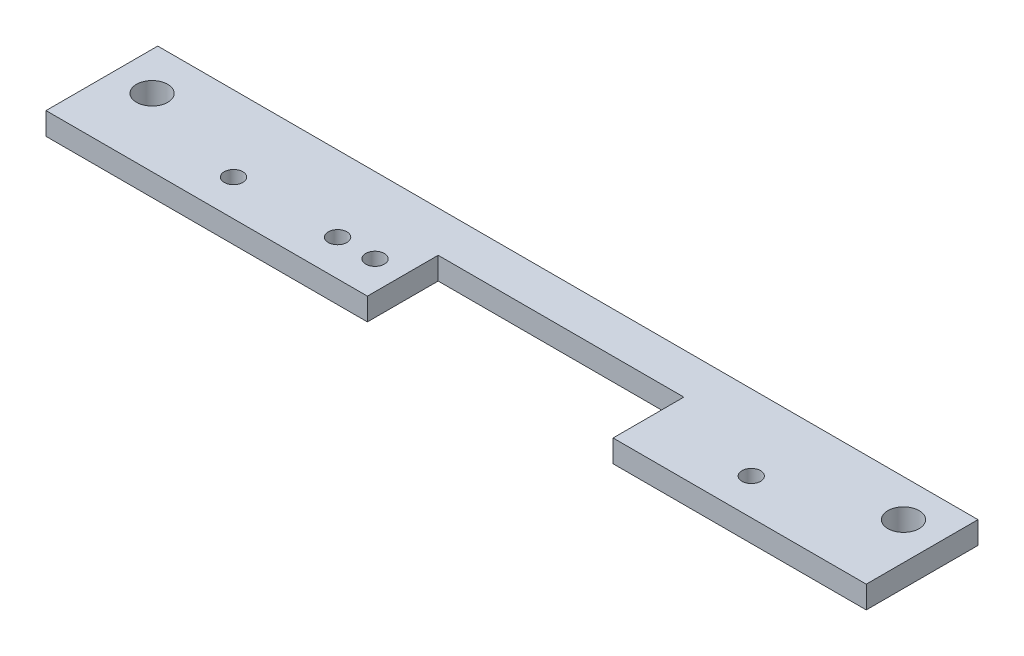
ISO-10303-21;
HEADER;
FILE_DESCRIPTION(('STEP AP214'),'2;1');
FILE_NAME('part.step','',(''),(''),'','','');
FILE_SCHEMA(('AUTOMOTIVE_DESIGN { 1 0 10303 214 1 1 1 1 }'));
ENDSEC;
DATA;
#1=APPLICATION_CONTEXT('core data for automotive mechanical design processes');
#2=APPLICATION_PROTOCOL_DEFINITION('international standard','automotive_design',2000,#1);
#3=PRODUCT_CONTEXT('',#1,'mechanical');
#4=PRODUCT('Part','Part','',(#3));
#5=PRODUCT_RELATED_PRODUCT_CATEGORY('part','',(#4));
#6=PRODUCT_DEFINITION_FORMATION('','',#4);
#7=PRODUCT_DEFINITION_CONTEXT('part definition',#1,'design');
#8=PRODUCT_DEFINITION('design','',#6,#7);
#9=PRODUCT_DEFINITION_SHAPE('','',#8);
#10=(LENGTH_UNIT() NAMED_UNIT(*) SI_UNIT(.MILLI.,.METRE.));
#11=(NAMED_UNIT(*) PLANE_ANGLE_UNIT() SI_UNIT($,.RADIAN.));
#12=(NAMED_UNIT(*) SI_UNIT($,.STERADIAN.) SOLID_ANGLE_UNIT());
#13=UNCERTAINTY_MEASURE_WITH_UNIT(LENGTH_MEASURE(1.E-05),#10,'distance_accuracy_value','');
#14=(GEOMETRIC_REPRESENTATION_CONTEXT(3) GLOBAL_UNCERTAINTY_ASSIGNED_CONTEXT((#13)) GLOBAL_UNIT_ASSIGNED_CONTEXT((#10,
#11,#12)) REPRESENTATION_CONTEXT('',''));
#15=CARTESIAN_POINT('',(0.,0.,0.));
#16=DIRECTION('',(0.,0.,1.));
#17=DIRECTION('',(1.,0.,0.));
#18=AXIS2_PLACEMENT_3D('',#15,#16,#17);
#19=CARTESIAN_POINT('',(-55.055,3.,7.5));
#20=DIRECTION('',(0.,0.,-1.));
#21=DIRECTION('',(-1.,0.,0.));
#22=AXIS2_PLACEMENT_3D('',#19,#20,#21);
#23=PLANE('',#22);
#24=DIRECTION('',(1.,0.,0.));
#25=VECTOR('',#24,1.);
#26=CARTESIAN_POINT('',(-55.055,0.,7.5));
#27=LINE('',#26,#25);
#28=CARTESIAN_POINT('',(-55.055,0.,7.5));
#29=VERTEX_POINT('',#28);
#30=CARTESIAN_POINT('',(-11.911431368498,0.,7.5));
#31=VERTEX_POINT('',#30);
#32=EDGE_CURVE('E137',#29,#31,#27,.T.);
#33=ORIENTED_EDGE('',*,*,#32,.T.);
#34=DIRECTION('',(0.,1.,0.));
#35=VECTOR('',#34,1.);
#36=CARTESIAN_POINT('',(-11.911431368498,0.,7.5));
#37=LINE('',#36,#35);
#38=CARTESIAN_POINT('',(-11.911431368498,3.,7.5));
#39=VERTEX_POINT('',#38);
#40=EDGE_CURVE('E164',#31,#39,#37,.T.);
#41=ORIENTED_EDGE('',*,*,#40,.T.);
#42=DIRECTION('',(1.,0.,0.));
#43=VECTOR('',#42,1.);
#44=CARTESIAN_POINT('',(-55.055,3.,7.5));
#45=LINE('',#44,#43);
#46=CARTESIAN_POINT('',(-55.055,3.,7.5));
#47=VERTEX_POINT('',#46);
#48=EDGE_CURVE('E151',#47,#39,#45,.T.);
#49=ORIENTED_EDGE('',*,*,#48,.F.);
#50=DIRECTION('',(0.,-1.,0.));
#51=VECTOR('',#50,1.);
#52=CARTESIAN_POINT('',(-55.055,3.,7.5));
#53=LINE('',#52,#51);
#54=EDGE_CURVE('E150',#47,#29,#53,.T.);
#55=ORIENTED_EDGE('',*,*,#54,.T.);
#56=EDGE_LOOP('',(#33,#41,#49,#55));
#57=FACE_BOUND('',#56,.T.);
#58=ADVANCED_FACE('F39',(#57),#23,.F.);
#59=CARTESIAN_POINT('',(0.,3.,0.));
#60=DIRECTION('',(0.,-1.,0.));
#61=DIRECTION('',(0.,0.,-1.));
#62=AXIS2_PLACEMENT_3D('',#59,#60,#61);
#63=PLANE('',#62);
#64=DIRECTION('',(-1.,0.,0.));
#65=VECTOR('',#64,1.);
#66=CARTESIAN_POINT('',(-11.911431368498,3.,-1.99955122375872));
#67=LINE('',#66,#65);
#68=CARTESIAN_POINT('',(21.0683567200993,3.,-1.99955122375872));
#69=VERTEX_POINT('',#68);
#70=CARTESIAN_POINT('',(-11.911431368498,3.,-1.99955122375872));
#71=VERTEX_POINT('',#70);
#72=EDGE_CURVE('E237',#69,#71,#67,.T.);
#73=ORIENTED_EDGE('',*,*,#72,.F.);
#74=DIRECTION('',(0.,0.,-1.));
#75=VECTOR('',#74,1.);
#76=CARTESIAN_POINT('',(21.0683567200993,3.,-1.99955122375872));
#77=LINE('',#76,#75);
#78=CARTESIAN_POINT('',(21.0683567200993,3.,7.5));
#79=VERTEX_POINT('',#78);
#80=EDGE_CURVE('E126',#79,#69,#77,.T.);
#81=ORIENTED_EDGE('',*,*,#80,.F.);
#82=CARTESIAN_POINT('',(55.055,3.,7.5));
#83=VERTEX_POINT('',#82);
#84=EDGE_CURVE('E57',#79,#83,#45,.T.);
#85=ORIENTED_EDGE('',*,*,#84,.T.);
#86=DIRECTION('',(0.,0.,-1.));
#87=VECTOR('',#86,1.);
#88=CARTESIAN_POINT('',(55.055,3.,7.5));
#89=LINE('',#88,#87);
#90=CARTESIAN_POINT('',(55.055,3.,-7.5));
#91=VERTEX_POINT('',#90);
#92=EDGE_CURVE('E142',#83,#91,#89,.T.);
#93=ORIENTED_EDGE('',*,*,#92,.T.);
#94=DIRECTION('',(-1.,0.,0.));
#95=VECTOR('',#94,1.);
#96=CARTESIAN_POINT('',(-55.055,3.,-7.5));
#97=LINE('',#96,#95);
#98=CARTESIAN_POINT('',(-55.055,3.,-7.5));
#99=VERTEX_POINT('',#98);
#100=EDGE_CURVE('E90',#91,#99,#97,.T.);
#101=ORIENTED_EDGE('',*,*,#100,.T.);
#102=DIRECTION('',(0.,0.,1.));
#103=VECTOR('',#102,1.);
#104=CARTESIAN_POINT('',(-55.055,3.,7.5));
#105=LINE('',#104,#103);
#106=EDGE_CURVE('E156',#99,#47,#105,.T.);
#107=ORIENTED_EDGE('',*,*,#106,.T.);
#108=ORIENTED_EDGE('',*,*,#48,.T.);
#109=DIRECTION('',(0.,0.,1.));
#110=VECTOR('',#109,1.);
#111=CARTESIAN_POINT('',(-11.911431368498,3.,7.5));
#112=LINE('',#111,#110);
#113=EDGE_CURVE('E241',#71,#39,#112,.T.);
#114=ORIENTED_EDGE('',*,*,#113,.F.);
#115=EDGE_LOOP('',(#73,#81,#85,#93,#101,#107,#108,#114));
#116=FACE_BOUND('',#115,.T.);
#117=CARTESIAN_POINT('',(50.055,3.,-2.50000000000002));
#118=DIRECTION('',(0.,1.,0.));
#119=DIRECTION('',(0.,0.,1.));
#120=AXIS2_PLACEMENT_3D('',#117,#118,#119);
#121=CIRCLE('',#120,2.1);
#122=CARTESIAN_POINT('',(50.055,3.,-0.400000000000026));
#123=VERTEX_POINT('',#122);
#124=EDGE_CURVE('E174',#123,#123,#121,.T.);
#125=ORIENTED_EDGE('',*,*,#124,.F.);
#126=EDGE_LOOP('',(#125));
#127=FACE_BOUND('',#126,.T.);
#128=CARTESIAN_POINT('',(-49.9411923064171,3.,-1.62734645016294));
#129=DIRECTION('',(0.,1.,0.));
#130=DIRECTION('',(0.,0.,1.));
#131=AXIS2_PLACEMENT_3D('',#128,#129,#130);
#132=CIRCLE('',#131,2.1);
#133=CARTESIAN_POINT('',(-49.9411923064171,3.,0.472653549837054));
#134=VERTEX_POINT('',#133);
#135=EDGE_CURVE('E188',#134,#134,#132,.T.);
#136=ORIENTED_EDGE('',*,*,#135,.F.);
#137=EDGE_LOOP('',(#136));
#138=FACE_BOUND('',#137,.T.);
#139=CARTESIAN_POINT('',(-20.7659046089109,3.,2.64603221322138));
#140=DIRECTION('',(0.,1.,0.));
#141=DIRECTION('',(0.,0.,1.));
#142=AXIS2_PLACEMENT_3D('',#139,#140,#141);
#143=CIRCLE('',#142,1.25);
#144=CARTESIAN_POINT('',(-20.7659046089109,3.,3.89603221322138));
#145=VERTEX_POINT('',#144);
#146=EDGE_CURVE('E196',#145,#145,#143,.T.);
#147=ORIENTED_EDGE('',*,*,#146,.F.);
#148=EDGE_LOOP('',(#147));
#149=FACE_BOUND('',#148,.T.);
#150=CARTESIAN_POINT('',(-34.7359046089109,3.,2.64603221322138));
#151=DIRECTION('',(0.,1.,0.));
#152=DIRECTION('',(0.,0.,1.));
#153=AXIS2_PLACEMENT_3D('',#150,#151,#152);
#154=CIRCLE('',#153,1.25);
#155=CARTESIAN_POINT('',(-34.7359046089109,3.,3.89603221322138));
#156=VERTEX_POINT('',#155);
#157=EDGE_CURVE('E204',#156,#156,#154,.T.);
#158=ORIENTED_EDGE('',*,*,#157,.F.);
#159=EDGE_LOOP('',(#158));
#160=FACE_BOUND('',#159,.T.);
#161=CARTESIAN_POINT('',(-15.7359046089109,3.,2.64603221322138));
#162=DIRECTION('',(0.,1.,0.));
#163=DIRECTION('',(0.,0.,1.));
#164=AXIS2_PLACEMENT_3D('',#161,#162,#163);
#165=CIRCLE('',#164,1.25);
#166=CARTESIAN_POINT('',(-15.7359046089109,3.,3.89603221322138));
#167=VERTEX_POINT('',#166);
#168=EDGE_CURVE('E212',#167,#167,#165,.T.);
#169=ORIENTED_EDGE('',*,*,#168,.F.);
#170=EDGE_LOOP('',(#169));
#171=FACE_BOUND('',#170,.T.);
#172=CARTESIAN_POINT('',(34.7640953910891,3.,2.64603221322138));
#173=DIRECTION('',(0.,1.,0.));
#174=DIRECTION('',(0.,0.,1.));
#175=AXIS2_PLACEMENT_3D('',#172,#173,#174);
#176=CIRCLE('',#175,1.25);
#177=CARTESIAN_POINT('',(34.7640953910891,3.,3.89603221322138));
#178=VERTEX_POINT('',#177);
#179=EDGE_CURVE('E220',#178,#178,#176,.T.);
#180=ORIENTED_EDGE('',*,*,#179,.F.);
#181=EDGE_LOOP('',(#180));
#182=FACE_BOUND('',#181,.T.);
#183=ADVANCED_FACE('F251',(#116,#127,#138,#149,#160,#171,#182),#63,.F.);
#184=CARTESIAN_POINT('',(0.,0.,0.));
#185=DIRECTION('',(0.,-1.,0.));
#186=DIRECTION('',(0.,0.,-1.));
#187=AXIS2_PLACEMENT_3D('',#184,#185,#186);
#188=PLANE('',#187);
#189=DIRECTION('',(0.,0.,-1.));
#190=VECTOR('',#189,1.);
#191=CARTESIAN_POINT('',(21.0683567200993,0.,-1.99955122375872));
#192=LINE('',#191,#190);
#193=CARTESIAN_POINT('',(21.0683567200993,0.,7.5));
#194=VERTEX_POINT('',#193);
#195=CARTESIAN_POINT('',(21.0683567200993,0.,-1.99955122375872));
#196=VERTEX_POINT('',#195);
#197=EDGE_CURVE('E117',#194,#196,#192,.T.);
#198=ORIENTED_EDGE('',*,*,#197,.T.);
#199=DIRECTION('',(-1.,0.,0.));
#200=VECTOR('',#199,1.);
#201=CARTESIAN_POINT('',(-11.911431368498,0.,-1.99955122375872));
#202=LINE('',#201,#200);
#203=CARTESIAN_POINT('',(-11.911431368498,0.,-1.99955122375872));
#204=VERTEX_POINT('',#203);
#205=EDGE_CURVE('E234',#196,#204,#202,.T.);
#206=ORIENTED_EDGE('',*,*,#205,.T.);
#207=DIRECTION('',(0.,0.,1.));
#208=VECTOR('',#207,1.);
#209=CARTESIAN_POINT('',(-11.911431368498,0.,7.5));
#210=LINE('',#209,#208);
#211=EDGE_CURVE('E160',#204,#31,#210,.T.);
#212=ORIENTED_EDGE('',*,*,#211,.T.);
#213=ORIENTED_EDGE('',*,*,#32,.F.);
#214=DIRECTION('',(0.,0.,1.));
#215=VECTOR('',#214,1.);
#216=CARTESIAN_POINT('',(-55.055,0.,7.5));
#217=LINE('',#216,#215);
#218=CARTESIAN_POINT('',(-55.055,0.,-7.5));
#219=VERTEX_POINT('',#218);
#220=EDGE_CURVE('E76',#219,#29,#217,.T.);
#221=ORIENTED_EDGE('',*,*,#220,.F.);
#222=DIRECTION('',(-1.,0.,0.));
#223=VECTOR('',#222,1.);
#224=CARTESIAN_POINT('',(-55.055,0.,-7.5));
#225=LINE('',#224,#223);
#226=CARTESIAN_POINT('',(55.055,0.,-7.5));
#227=VERTEX_POINT('',#226);
#228=EDGE_CURVE('E143',#227,#219,#225,.T.);
#229=ORIENTED_EDGE('',*,*,#228,.F.);
#230=DIRECTION('',(0.,0.,-1.));
#231=VECTOR('',#230,1.);
#232=CARTESIAN_POINT('',(55.055,0.,7.5));
#233=LINE('',#232,#231);
#234=CARTESIAN_POINT('',(55.055,0.,7.5));
#235=VERTEX_POINT('',#234);
#236=EDGE_CURVE('E135',#235,#227,#233,.T.);
#237=ORIENTED_EDGE('',*,*,#236,.F.);
#238=EDGE_CURVE('E83',#194,#235,#27,.T.);
#239=ORIENTED_EDGE('',*,*,#238,.F.);
#240=EDGE_LOOP('',(#198,#206,#212,#213,#221,#229,#237,#239));
#241=FACE_BOUND('',#240,.T.);
#242=CARTESIAN_POINT('',(-15.7359046089109,0.,2.64603221322138));
#243=DIRECTION('',(0.,1.,0.));
#244=DIRECTION('',(0.,0.,1.));
#245=AXIS2_PLACEMENT_3D('',#242,#243,#244);
#246=CIRCLE('',#245,1.25);
#247=CARTESIAN_POINT('',(-15.7359046089109,0.,3.89603221322138));
#248=VERTEX_POINT('',#247);
#249=EDGE_CURVE('E216',#248,#248,#246,.T.);
#250=ORIENTED_EDGE('',*,*,#249,.T.);
#251=EDGE_LOOP('',(#250));
#252=FACE_BOUND('',#251,.T.);
#253=CARTESIAN_POINT('',(-20.7659046089109,0.,2.64603221322138));
#254=DIRECTION('',(0.,1.,0.));
#255=DIRECTION('',(0.,0.,1.));
#256=AXIS2_PLACEMENT_3D('',#253,#254,#255);
#257=CIRCLE('',#256,1.25);
#258=CARTESIAN_POINT('',(-20.7659046089109,0.,3.89603221322138));
#259=VERTEX_POINT('',#258);
#260=EDGE_CURVE('E200',#259,#259,#257,.T.);
#261=ORIENTED_EDGE('',*,*,#260,.T.);
#262=EDGE_LOOP('',(#261));
#263=FACE_BOUND('',#262,.T.);
#264=CARTESIAN_POINT('',(50.055,0.,-2.50000000000002));
#265=DIRECTION('',(0.,1.,0.));
#266=DIRECTION('',(0.,0.,1.));
#267=AXIS2_PLACEMENT_3D('',#264,#265,#266);
#268=CIRCLE('',#267,2.1);
#269=CARTESIAN_POINT('',(50.055,0.,-0.400000000000026));
#270=VERTEX_POINT('',#269);
#271=EDGE_CURVE('E184',#270,#270,#268,.T.);
#272=ORIENTED_EDGE('',*,*,#271,.T.);
#273=EDGE_LOOP('',(#272));
#274=FACE_BOUND('',#273,.T.);
#275=CARTESIAN_POINT('',(-49.9411923064171,0.,-1.62734645016294));
#276=DIRECTION('',(0.,1.,0.));
#277=DIRECTION('',(0.,0.,1.));
#278=AXIS2_PLACEMENT_3D('',#275,#276,#277);
#279=CIRCLE('',#278,2.1);
#280=CARTESIAN_POINT('',(-49.9411923064171,0.,0.472653549837054));
#281=VERTEX_POINT('',#280);
#282=EDGE_CURVE('E192',#281,#281,#279,.T.);
#283=ORIENTED_EDGE('',*,*,#282,.T.);
#284=EDGE_LOOP('',(#283));
#285=FACE_BOUND('',#284,.T.);
#286=CARTESIAN_POINT('',(-34.7359046089109,0.,2.64603221322138));
#287=DIRECTION('',(0.,1.,0.));
#288=DIRECTION('',(0.,0.,1.));
#289=AXIS2_PLACEMENT_3D('',#286,#287,#288);
#290=CIRCLE('',#289,1.25);
#291=CARTESIAN_POINT('',(-34.7359046089109,0.,3.89603221322138));
#292=VERTEX_POINT('',#291);
#293=EDGE_CURVE('E208',#292,#292,#290,.T.);
#294=ORIENTED_EDGE('',*,*,#293,.T.);
#295=EDGE_LOOP('',(#294));
#296=FACE_BOUND('',#295,.T.);
#297=CARTESIAN_POINT('',(34.7640953910891,0.,2.64603221322138));
#298=DIRECTION('',(0.,1.,0.));
#299=DIRECTION('',(0.,0.,1.));
#300=AXIS2_PLACEMENT_3D('',#297,#298,#299);
#301=CIRCLE('',#300,1.25);
#302=CARTESIAN_POINT('',(34.7640953910891,0.,3.89603221322138));
#303=VERTEX_POINT('',#302);
#304=EDGE_CURVE('E224',#303,#303,#301,.T.);
#305=ORIENTED_EDGE('',*,*,#304,.T.);
#306=EDGE_LOOP('',(#305));
#307=FACE_BOUND('',#306,.T.);
#308=ADVANCED_FACE('F132',(#241,#252,#263,#274,#285,#296,#307),#188,.T.);
#309=CARTESIAN_POINT('',(55.055,3.,7.5));
#310=DIRECTION('',(-1.,0.,0.));
#311=DIRECTION('',(0.,0.,1.));
#312=AXIS2_PLACEMENT_3D('',#309,#310,#311);
#313=PLANE('',#312);
#314=ORIENTED_EDGE('',*,*,#236,.T.);
#315=DIRECTION('',(0.,-1.,0.));
#316=VECTOR('',#315,1.);
#317=CARTESIAN_POINT('',(55.055,3.,-7.5));
#318=LINE('',#317,#316);
#319=EDGE_CURVE('E11',#91,#227,#318,.T.);
#320=ORIENTED_EDGE('',*,*,#319,.F.);
#321=ORIENTED_EDGE('',*,*,#92,.F.);
#322=DIRECTION('',(0.,-1.,0.));
#323=VECTOR('',#322,1.);
#324=CARTESIAN_POINT('',(55.055,3.,7.5));
#325=LINE('',#324,#323);
#326=EDGE_CURVE('E147',#83,#235,#325,.T.);
#327=ORIENTED_EDGE('',*,*,#326,.T.);
#328=EDGE_LOOP('',(#314,#320,#321,#327));
#329=FACE_BOUND('',#328,.T.);
#330=ADVANCED_FACE('F41',(#329),#313,.F.);
#331=CARTESIAN_POINT('',(-55.055,3.,-7.5));
#332=DIRECTION('',(0.,0.,1.));
#333=DIRECTION('',(1.,0.,0.));
#334=AXIS2_PLACEMENT_3D('',#331,#332,#333);
#335=PLANE('',#334);
#336=ORIENTED_EDGE('',*,*,#228,.T.);
#337=DIRECTION('',(0.,-1.,0.));
#338=VECTOR('',#337,1.);
#339=CARTESIAN_POINT('',(-55.055,3.,-7.5));
#340=LINE('',#339,#338);
#341=EDGE_CURVE('E49',#99,#219,#340,.T.);
#342=ORIENTED_EDGE('',*,*,#341,.F.);
#343=ORIENTED_EDGE('',*,*,#100,.F.);
#344=ORIENTED_EDGE('',*,*,#319,.T.);
#345=EDGE_LOOP('',(#336,#342,#343,#344));
#346=FACE_BOUND('',#345,.T.);
#347=ADVANCED_FACE('F176',(#346),#335,.F.);
#348=CARTESIAN_POINT('',(-55.055,3.,7.5));
#349=DIRECTION('',(1.,0.,0.));
#350=DIRECTION('',(0.,0.,-1.));
#351=AXIS2_PLACEMENT_3D('',#348,#349,#350);
#352=PLANE('',#351);
#353=ORIENTED_EDGE('',*,*,#220,.T.);
#354=ORIENTED_EDGE('',*,*,#54,.F.);
#355=ORIENTED_EDGE('',*,*,#106,.F.);
#356=ORIENTED_EDGE('',*,*,#341,.T.);
#357=EDGE_LOOP('',(#353,#354,#355,#356));
#358=FACE_BOUND('',#357,.T.);
#359=ADVANCED_FACE('F155',(#358),#352,.F.);
#360=ORIENTED_EDGE('',*,*,#84,.F.);
#361=DIRECTION('',(0.,1.,0.));
#362=VECTOR('',#361,1.);
#363=CARTESIAN_POINT('',(21.0683567200993,0.,7.5));
#364=LINE('',#363,#362);
#365=EDGE_CURVE('E120',#194,#79,#364,.T.);
#366=ORIENTED_EDGE('',*,*,#365,.F.);
#367=ORIENTED_EDGE('',*,*,#238,.T.);
#368=ORIENTED_EDGE('',*,*,#326,.F.);
#369=EDGE_LOOP('',(#360,#366,#367,#368));
#370=FACE_BOUND('',#369,.T.);
#371=ADVANCED_FACE('F128',(#370),#23,.F.);
#372=CARTESIAN_POINT('',(50.055,3.,-2.50000000000002));
#373=DIRECTION('',(0.,-1.,0.));
#374=DIRECTION('',(0.,0.,-1.));
#375=AXIS2_PLACEMENT_3D('',#372,#373,#374);
#376=CYLINDRICAL_SURFACE('',#375,2.1);
#377=ORIENTED_EDGE('',*,*,#124,.T.);
#378=EDGE_LOOP('',(#377));
#379=FACE_BOUND('',#378,.T.);
#380=ORIENTED_EDGE('',*,*,#271,.F.);
#381=EDGE_LOOP('',(#380));
#382=FACE_BOUND('',#381,.T.);
#383=ADVANCED_FACE('F277',(#379,#382),#376,.F.);
#384=CARTESIAN_POINT('',(-49.9411923064171,3.,-1.62734645016294));
#385=DIRECTION('',(0.,-1.,0.));
#386=DIRECTION('',(0.,0.,-1.));
#387=AXIS2_PLACEMENT_3D('',#384,#385,#386);
#388=CYLINDRICAL_SURFACE('',#387,2.1);
#389=ORIENTED_EDGE('',*,*,#135,.T.);
#390=EDGE_LOOP('',(#389));
#391=FACE_BOUND('',#390,.T.);
#392=ORIENTED_EDGE('',*,*,#282,.F.);
#393=EDGE_LOOP('',(#392));
#394=FACE_BOUND('',#393,.T.);
#395=ADVANCED_FACE('F282',(#391,#394),#388,.F.);
#396=CARTESIAN_POINT('',(-20.7659046089109,3.,2.64603221322138));
#397=DIRECTION('',(0.,-1.,0.));
#398=DIRECTION('',(0.,0.,-1.));
#399=AXIS2_PLACEMENT_3D('',#396,#397,#398);
#400=CYLINDRICAL_SURFACE('',#399,1.25);
#401=ORIENTED_EDGE('',*,*,#146,.T.);
#402=EDGE_LOOP('',(#401));
#403=FACE_BOUND('',#402,.T.);
#404=ORIENTED_EDGE('',*,*,#260,.F.);
#405=EDGE_LOOP('',(#404));
#406=FACE_BOUND('',#405,.T.);
#407=ADVANCED_FACE('F299',(#403,#406),#400,.F.);
#408=CARTESIAN_POINT('',(-34.7359046089109,3.,2.64603221322138));
#409=DIRECTION('',(0.,-1.,0.));
#410=DIRECTION('',(0.,0.,-1.));
#411=AXIS2_PLACEMENT_3D('',#408,#409,#410);
#412=CYLINDRICAL_SURFACE('',#411,1.25);
#413=ORIENTED_EDGE('',*,*,#157,.T.);
#414=EDGE_LOOP('',(#413));
#415=FACE_BOUND('',#414,.T.);
#416=ORIENTED_EDGE('',*,*,#293,.F.);
#417=EDGE_LOOP('',(#416));
#418=FACE_BOUND('',#417,.T.);
#419=ADVANCED_FACE('F303',(#415,#418),#412,.F.);
#420=CARTESIAN_POINT('',(-15.7359046089109,3.,2.64603221322138));
#421=DIRECTION('',(0.,-1.,0.));
#422=DIRECTION('',(0.,0.,-1.));
#423=AXIS2_PLACEMENT_3D('',#420,#421,#422);
#424=CYLINDRICAL_SURFACE('',#423,1.25);
#425=ORIENTED_EDGE('',*,*,#168,.T.);
#426=EDGE_LOOP('',(#425));
#427=FACE_BOUND('',#426,.T.);
#428=ORIENTED_EDGE('',*,*,#249,.F.);
#429=EDGE_LOOP('',(#428));
#430=FACE_BOUND('',#429,.T.);
#431=ADVANCED_FACE('F265',(#427,#430),#424,.F.);
#432=CARTESIAN_POINT('',(34.7640953910891,3.,2.64603221322138));
#433=DIRECTION('',(0.,-1.,0.));
#434=DIRECTION('',(0.,0.,-1.));
#435=AXIS2_PLACEMENT_3D('',#432,#433,#434);
#436=CYLINDRICAL_SURFACE('',#435,1.25);
#437=ORIENTED_EDGE('',*,*,#179,.T.);
#438=EDGE_LOOP('',(#437));
#439=FACE_BOUND('',#438,.T.);
#440=ORIENTED_EDGE('',*,*,#304,.F.);
#441=EDGE_LOOP('',(#440));
#442=FACE_BOUND('',#441,.T.);
#443=ADVANCED_FACE('F258',(#439,#442),#436,.F.);
#444=CARTESIAN_POINT('',(-11.911431368498,0.,7.5));
#445=DIRECTION('',(-1.,0.,0.));
#446=DIRECTION('',(0.,0.,1.));
#447=AXIS2_PLACEMENT_3D('',#444,#445,#446);
#448=PLANE('',#447);
#449=ORIENTED_EDGE('',*,*,#113,.T.);
#450=ORIENTED_EDGE('',*,*,#40,.F.);
#451=ORIENTED_EDGE('',*,*,#211,.F.);
#452=DIRECTION('',(0.,1.,0.));
#453=VECTOR('',#452,1.);
#454=CARTESIAN_POINT('',(-11.911431368498,0.,-1.99955122375872));
#455=LINE('',#454,#453);
#456=EDGE_CURVE('E228',#204,#71,#455,.T.);
#457=ORIENTED_EDGE('',*,*,#456,.T.);
#458=EDGE_LOOP('',(#449,#450,#451,#457));
#459=FACE_BOUND('',#458,.T.);
#460=ADVANCED_FACE('F256',(#459),#448,.F.);
#461=CARTESIAN_POINT('',(-11.911431368498,0.,-1.99955122375872));
#462=DIRECTION('',(0.,0.,-1.));
#463=DIRECTION('',(-1.,0.,0.));
#464=AXIS2_PLACEMENT_3D('',#461,#462,#463);
#465=PLANE('',#464);
#466=ORIENTED_EDGE('',*,*,#72,.T.);
#467=ORIENTED_EDGE('',*,*,#456,.F.);
#468=ORIENTED_EDGE('',*,*,#205,.F.);
#469=DIRECTION('',(0.,1.,0.));
#470=VECTOR('',#469,1.);
#471=CARTESIAN_POINT('',(21.0683567200993,0.,-1.99955122375872));
#472=LINE('',#471,#470);
#473=EDGE_CURVE('E122',#196,#69,#472,.T.);
#474=ORIENTED_EDGE('',*,*,#473,.T.);
#475=EDGE_LOOP('',(#466,#467,#468,#474));
#476=FACE_BOUND('',#475,.T.);
#477=ADVANCED_FACE('F254',(#476),#465,.F.);
#478=CARTESIAN_POINT('',(21.0683567200993,0.,-1.99955122375872));
#479=DIRECTION('',(1.,0.,0.));
#480=DIRECTION('',(0.,0.,-1.));
#481=AXIS2_PLACEMENT_3D('',#478,#479,#480);
#482=PLANE('',#481);
#483=ORIENTED_EDGE('',*,*,#80,.T.);
#484=ORIENTED_EDGE('',*,*,#473,.F.);
#485=ORIENTED_EDGE('',*,*,#197,.F.);
#486=ORIENTED_EDGE('',*,*,#365,.T.);
#487=EDGE_LOOP('',(#483,#484,#485,#486));
#488=FACE_BOUND('',#487,.T.);
#489=ADVANCED_FACE('F119',(#488),#482,.F.);
#490=CLOSED_SHELL('',(#58,#183,#308,#330,#347,#359,#371,#383,#395,#407,#419,#431,#443,#460,#477,#489));
#491=MANIFOLD_SOLID_BREP('B2',#490);
#492=ADVANCED_BREP_SHAPE_REPRESENTATION('',(#18,#491),#14);
#493=SHAPE_DEFINITION_REPRESENTATION(#9,#492);
ENDSEC;
END-ISO-10303-21;
